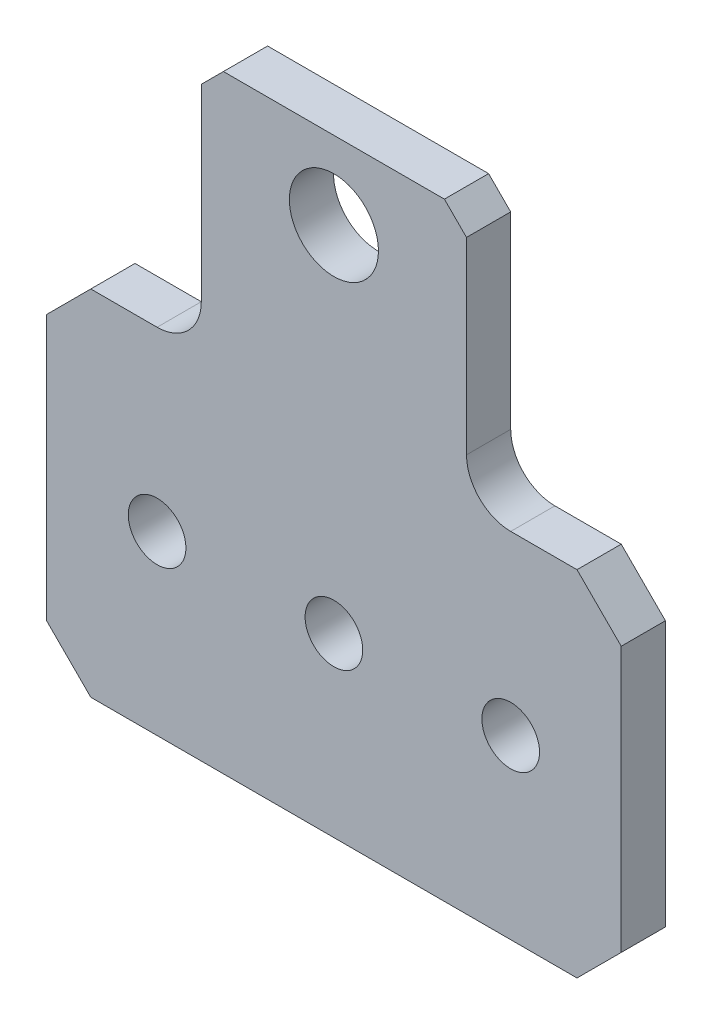
ISO-10303-21;
HEADER;
FILE_DESCRIPTION(('STEP AP214'),'2;1');
FILE_NAME('part.step','',(''),(''),'','','');
FILE_SCHEMA(('AUTOMOTIVE_DESIGN { 1 0 10303 214 1 1 1 1 }'));
ENDSEC;
DATA;
#1=APPLICATION_CONTEXT('core data for automotive mechanical design processes');
#2=APPLICATION_PROTOCOL_DEFINITION('international standard','automotive_design',2000,#1);
#3=PRODUCT_CONTEXT('',#1,'mechanical');
#4=PRODUCT('Part','Part','',(#3));
#5=PRODUCT_RELATED_PRODUCT_CATEGORY('part','',(#4));
#6=PRODUCT_DEFINITION_FORMATION('','',#4);
#7=PRODUCT_DEFINITION_CONTEXT('part definition',#1,'design');
#8=PRODUCT_DEFINITION('design','',#6,#7);
#9=PRODUCT_DEFINITION_SHAPE('','',#8);
#10=(LENGTH_UNIT() NAMED_UNIT(*) SI_UNIT(.MILLI.,.METRE.));
#11=(NAMED_UNIT(*) PLANE_ANGLE_UNIT() SI_UNIT($,.RADIAN.));
#12=(NAMED_UNIT(*) SI_UNIT($,.STERADIAN.) SOLID_ANGLE_UNIT());
#13=UNCERTAINTY_MEASURE_WITH_UNIT(LENGTH_MEASURE(1.E-05),#10,'distance_accuracy_value','');
#14=(GEOMETRIC_REPRESENTATION_CONTEXT(3) GLOBAL_UNCERTAINTY_ASSIGNED_CONTEXT((#13)) GLOBAL_UNIT_ASSIGNED_CONTEXT((#10,
#11,#12)) REPRESENTATION_CONTEXT('',''));
#15=CARTESIAN_POINT('',(0.,0.,0.));
#16=DIRECTION('',(0.,0.,1.));
#17=DIRECTION('',(1.,0.,0.));
#18=AXIS2_PLACEMENT_3D('',#15,#16,#17);
#19=CARTESIAN_POINT('',(12.7,-15.494,3.175));
#20=DIRECTION('',(0.,1.,0.));
#21=DIRECTION('',(-1.,0.,0.));
#22=AXIS2_PLACEMENT_3D('',#19,#20,#21);
#23=PLANE('',#22);
#24=DIRECTION('',(1.,0.,0.));
#25=VECTOR('',#24,1.);
#26=CARTESIAN_POINT('',(12.7,-15.494,0.));
#27=LINE('',#26,#25);
#28=CARTESIAN_POINT('',(12.7,-15.494,0.));
#29=VERTEX_POINT('',#28);
#30=CARTESIAN_POINT('',(17.4625,-15.494,0.));
#31=VERTEX_POINT('',#30);
#32=EDGE_CURVE('E177',#29,#31,#27,.T.);
#33=ORIENTED_EDGE('',*,*,#32,.F.);
#34=DIRECTION('',(0.,0.,-1.));
#35=VECTOR('',#34,1.);
#36=CARTESIAN_POINT('',(12.7,-15.494,3.175));
#37=LINE('',#36,#35);
#38=CARTESIAN_POINT('',(12.7,-15.494,3.175));
#39=VERTEX_POINT('',#38);
#40=EDGE_CURVE('E11',#39,#29,#37,.T.);
#41=ORIENTED_EDGE('',*,*,#40,.F.);
#42=DIRECTION('',(1.,0.,0.));
#43=VECTOR('',#42,1.);
#44=CARTESIAN_POINT('',(12.7,-15.494,3.175));
#45=LINE('',#44,#43);
#46=CARTESIAN_POINT('',(17.4625,-15.494,3.175));
#47=VERTEX_POINT('',#46);
#48=EDGE_CURVE('E219',#39,#47,#45,.T.);
#49=ORIENTED_EDGE('',*,*,#48,.T.);
#50=DIRECTION('',(0.,0.,-1.));
#51=VECTOR('',#50,1.);
#52=CARTESIAN_POINT('',(17.4625,-15.494,3.175));
#53=LINE('',#52,#51);
#54=EDGE_CURVE('E38',#47,#31,#53,.T.);
#55=ORIENTED_EDGE('',*,*,#54,.T.);
#56=EDGE_LOOP('',(#33,#41,#49,#55));
#57=FACE_BOUND('',#56,.T.);
#58=ADVANCED_FACE('F35',(#57),#23,.T.);
#59=CARTESIAN_POINT('',(12.7,-12.319,3.175));
#60=DIRECTION('',(0.,0.,-1.));
#61=DIRECTION('',(-1.,0.,0.));
#62=AXIS2_PLACEMENT_3D('',#59,#60,#61);
#63=CYLINDRICAL_SURFACE('',#62,3.175);
#64=CARTESIAN_POINT('',(12.7,-12.319,0.));
#65=DIRECTION('',(0.,0.,1.));
#66=DIRECTION('',(1.,0.,0.));
#67=AXIS2_PLACEMENT_3D('',#64,#65,#66);
#68=CIRCLE('',#67,3.175);
#69=CARTESIAN_POINT('',(9.525,-12.319,0.));
#70=VERTEX_POINT('',#69);
#71=EDGE_CURVE('E217',#70,#29,#68,.T.);
#72=ORIENTED_EDGE('',*,*,#71,.F.);
#73=DIRECTION('',(0.,0.,-1.));
#74=VECTOR('',#73,1.);
#75=CARTESIAN_POINT('',(9.525,-12.319,3.175));
#76=LINE('',#75,#74);
#77=CARTESIAN_POINT('',(9.525,-12.319,3.175));
#78=VERTEX_POINT('',#77);
#79=EDGE_CURVE('E44',#78,#70,#76,.T.);
#80=ORIENTED_EDGE('',*,*,#79,.F.);
#81=CARTESIAN_POINT('',(12.7,-12.319,3.175));
#82=DIRECTION('',(0.,0.,1.));
#83=DIRECTION('',(1.,0.,0.));
#84=AXIS2_PLACEMENT_3D('',#81,#82,#83);
#85=CIRCLE('',#84,3.175);
#86=EDGE_CURVE('E165',#78,#39,#85,.T.);
#87=ORIENTED_EDGE('',*,*,#86,.T.);
#88=ORIENTED_EDGE('',*,*,#40,.T.);
#89=EDGE_LOOP('',(#72,#80,#87,#88));
#90=FACE_BOUND('',#89,.T.);
#91=ADVANCED_FACE('F248',(#90),#63,.F.);
#92=CARTESIAN_POINT('',(9.525,1.2065,3.175));
#93=DIRECTION('',(1.,0.,0.));
#94=DIRECTION('',(0.,0.,-1.));
#95=AXIS2_PLACEMENT_3D('',#92,#93,#94);
#96=PLANE('',#95);
#97=DIRECTION('',(0.,-1.,0.));
#98=VECTOR('',#97,1.);
#99=CARTESIAN_POINT('',(9.525,1.2065,0.));
#100=LINE('',#99,#98);
#101=CARTESIAN_POINT('',(9.525,1.2065,0.));
#102=VERTEX_POINT('',#101);
#103=EDGE_CURVE('E151',#102,#70,#100,.T.);
#104=ORIENTED_EDGE('',*,*,#103,.F.);
#105=DIRECTION('',(0.,0.,-1.));
#106=VECTOR('',#105,1.);
#107=CARTESIAN_POINT('',(9.525,1.2065,3.175));
#108=LINE('',#107,#106);
#109=CARTESIAN_POINT('',(9.525,1.2065,3.175));
#110=VERTEX_POINT('',#109);
#111=EDGE_CURVE('E146',#110,#102,#108,.T.);
#112=ORIENTED_EDGE('',*,*,#111,.F.);
#113=DIRECTION('',(0.,-1.,0.));
#114=VECTOR('',#113,1.);
#115=CARTESIAN_POINT('',(9.525,1.2065,3.175));
#116=LINE('',#115,#114);
#117=EDGE_CURVE('E149',#110,#78,#116,.T.);
#118=ORIENTED_EDGE('',*,*,#117,.T.);
#119=ORIENTED_EDGE('',*,*,#79,.T.);
#120=EDGE_LOOP('',(#104,#112,#118,#119));
#121=FACE_BOUND('',#120,.T.);
#122=ADVANCED_FACE('F148',(#121),#96,.T.);
#123=CARTESIAN_POINT('',(7.93749999999999,2.794,3.175));
#124=DIRECTION('',(0.707106781186546,0.707106781186549,0.));
#125=DIRECTION('',(-0.707106781186549,0.707106781186546,0.));
#126=AXIS2_PLACEMENT_3D('',#123,#124,#125);
#127=PLANE('',#126);
#128=DIRECTION('',(0.707106781186549,-0.707106781186546,0.));
#129=VECTOR('',#128,1.);
#130=CARTESIAN_POINT('',(7.93749999999999,2.794,0.));
#131=LINE('',#130,#129);
#132=CARTESIAN_POINT('',(7.93749999999999,2.794,0.));
#133=VERTEX_POINT('',#132);
#134=EDGE_CURVE('E214',#133,#102,#131,.T.);
#135=ORIENTED_EDGE('',*,*,#134,.F.);
#136=DIRECTION('',(0.,0.,-1.));
#137=VECTOR('',#136,1.);
#138=CARTESIAN_POINT('',(7.93749999999999,2.794,3.175));
#139=LINE('',#138,#137);
#140=CARTESIAN_POINT('',(7.93749999999999,2.794,3.175));
#141=VERTEX_POINT('',#140);
#142=EDGE_CURVE('E156',#141,#133,#139,.T.);
#143=ORIENTED_EDGE('',*,*,#142,.F.);
#144=DIRECTION('',(0.707106781186549,-0.707106781186546,0.));
#145=VECTOR('',#144,1.);
#146=CARTESIAN_POINT('',(7.93749999999999,2.794,3.175));
#147=LINE('',#146,#145);
#148=EDGE_CURVE('E164',#141,#110,#147,.T.);
#149=ORIENTED_EDGE('',*,*,#148,.T.);
#150=ORIENTED_EDGE('',*,*,#111,.T.);
#151=EDGE_LOOP('',(#135,#143,#149,#150));
#152=FACE_BOUND('',#151,.T.);
#153=ADVANCED_FACE('F168',(#152),#127,.T.);
#154=CARTESIAN_POINT('',(-9.525,1.20650000000001,3.175));
#155=DIRECTION('',(-0.707106781186547,0.707106781186548,0.));
#156=DIRECTION('',(-0.707106781186548,-0.707106781186547,0.));
#157=AXIS2_PLACEMENT_3D('',#154,#155,#156);
#158=PLANE('',#157);
#159=DIRECTION('',(0.707106781186548,0.707106781186547,0.));
#160=VECTOR('',#159,1.);
#161=CARTESIAN_POINT('',(-9.525,1.20650000000001,0.));
#162=LINE('',#161,#160);
#163=CARTESIAN_POINT('',(-9.525,1.20650000000001,0.));
#164=VERTEX_POINT('',#163);
#165=CARTESIAN_POINT('',(-7.93749999999999,2.794,0.));
#166=VERTEX_POINT('',#165);
#167=EDGE_CURVE('E211',#164,#166,#162,.T.);
#168=ORIENTED_EDGE('',*,*,#167,.F.);
#169=DIRECTION('',(0.,0.,-1.));
#170=VECTOR('',#169,1.);
#171=CARTESIAN_POINT('',(-9.525,1.20650000000001,3.175));
#172=LINE('',#171,#170);
#173=CARTESIAN_POINT('',(-9.525,1.20650000000001,3.175));
#174=VERTEX_POINT('',#173);
#175=EDGE_CURVE('E226',#174,#164,#172,.T.);
#176=ORIENTED_EDGE('',*,*,#175,.F.);
#177=DIRECTION('',(0.707106781186548,0.707106781186547,0.));
#178=VECTOR('',#177,1.);
#179=CARTESIAN_POINT('',(-9.525,1.20650000000001,3.175));
#180=LINE('',#179,#178);
#181=CARTESIAN_POINT('',(-7.93749999999999,2.794,3.175));
#182=VERTEX_POINT('',#181);
#183=EDGE_CURVE('E169',#174,#182,#180,.T.);
#184=ORIENTED_EDGE('',*,*,#183,.T.);
#185=DIRECTION('',(0.,0.,-1.));
#186=VECTOR('',#185,1.);
#187=CARTESIAN_POINT('',(-7.93749999999999,2.794,3.175));
#188=LINE('',#187,#186);
#189=EDGE_CURVE('E223',#182,#166,#188,.T.);
#190=ORIENTED_EDGE('',*,*,#189,.T.);
#191=EDGE_LOOP('',(#168,#176,#184,#190));
#192=FACE_BOUND('',#191,.T.);
#193=ADVANCED_FACE('F261',(#192),#158,.T.);
#194=CARTESIAN_POINT('',(-9.52499999999999,-12.319,3.175));
#195=DIRECTION('',(-1.,0.,0.));
#196=DIRECTION('',(0.,-1.,0.));
#197=AXIS2_PLACEMENT_3D('',#194,#195,#196);
#198=PLANE('',#197);
#199=DIRECTION('',(0.,1.,0.));
#200=VECTOR('',#199,1.);
#201=CARTESIAN_POINT('',(-9.52499999999999,-12.319,0.));
#202=LINE('',#201,#200);
#203=CARTESIAN_POINT('',(-9.52499999999999,-12.319,0.));
#204=VERTEX_POINT('',#203);
#205=EDGE_CURVE('E208',#204,#164,#202,.T.);
#206=ORIENTED_EDGE('',*,*,#205,.F.);
#207=DIRECTION('',(0.,0.,-1.));
#208=VECTOR('',#207,1.);
#209=CARTESIAN_POINT('',(-9.52499999999999,-12.319,3.175));
#210=LINE('',#209,#208);
#211=CARTESIAN_POINT('',(-9.52499999999999,-12.319,3.175));
#212=VERTEX_POINT('',#211);
#213=EDGE_CURVE('E228',#212,#204,#210,.T.);
#214=ORIENTED_EDGE('',*,*,#213,.F.);
#215=DIRECTION('',(0.,1.,0.));
#216=VECTOR('',#215,1.);
#217=CARTESIAN_POINT('',(-9.52499999999999,-12.319,3.175));
#218=LINE('',#217,#216);
#219=EDGE_CURVE('E172',#212,#174,#218,.T.);
#220=ORIENTED_EDGE('',*,*,#219,.T.);
#221=ORIENTED_EDGE('',*,*,#175,.T.);
#222=EDGE_LOOP('',(#206,#214,#220,#221));
#223=FACE_BOUND('',#222,.T.);
#224=ADVANCED_FACE('F264',(#223),#198,.T.);
#225=CARTESIAN_POINT('',(-12.7,-12.319,3.175));
#226=DIRECTION('',(0.,0.,-1.));
#227=DIRECTION('',(-1.,0.,0.));
#228=AXIS2_PLACEMENT_3D('',#225,#226,#227);
#229=CYLINDRICAL_SURFACE('',#228,3.175);
#230=CARTESIAN_POINT('',(-12.7,-12.319,0.));
#231=DIRECTION('',(0.,0.,1.));
#232=DIRECTION('',(1.,0.,0.));
#233=AXIS2_PLACEMENT_3D('',#230,#231,#232);
#234=CIRCLE('',#233,3.175);
#235=CARTESIAN_POINT('',(-12.7,-15.494,0.));
#236=VERTEX_POINT('',#235);
#237=EDGE_CURVE('E205',#236,#204,#234,.T.);
#238=ORIENTED_EDGE('',*,*,#237,.F.);
#239=DIRECTION('',(0.,0.,-1.));
#240=VECTOR('',#239,1.);
#241=CARTESIAN_POINT('',(-12.7,-15.494,3.175));
#242=LINE('',#241,#240);
#243=CARTESIAN_POINT('',(-12.7,-15.494,3.175));
#244=VERTEX_POINT('',#243);
#245=EDGE_CURVE('E230',#244,#236,#242,.T.);
#246=ORIENTED_EDGE('',*,*,#245,.F.);
#247=CARTESIAN_POINT('',(-12.7,-12.319,3.175));
#248=DIRECTION('',(0.,0.,1.));
#249=DIRECTION('',(1.,0.,0.));
#250=AXIS2_PLACEMENT_3D('',#247,#248,#249);
#251=CIRCLE('',#250,3.175);
#252=EDGE_CURVE('E387',#244,#212,#251,.T.);
#253=ORIENTED_EDGE('',*,*,#252,.T.);
#254=ORIENTED_EDGE('',*,*,#213,.T.);
#255=EDGE_LOOP('',(#238,#246,#253,#254));
#256=FACE_BOUND('',#255,.T.);
#257=ADVANCED_FACE('F268',(#256),#229,.F.);
#258=CARTESIAN_POINT('',(-17.4625,-15.494,3.175));
#259=DIRECTION('',(0.,1.,0.));
#260=DIRECTION('',(0.,0.,1.));
#261=AXIS2_PLACEMENT_3D('',#258,#259,#260);
#262=PLANE('',#261);
#263=DIRECTION('',(1.,0.,0.));
#264=VECTOR('',#263,1.);
#265=CARTESIAN_POINT('',(-17.4625,-15.494,0.));
#266=LINE('',#265,#264);
#267=CARTESIAN_POINT('',(-17.4625,-15.494,0.));
#268=VERTEX_POINT('',#267);
#269=EDGE_CURVE('E202',#268,#236,#266,.T.);
#270=ORIENTED_EDGE('',*,*,#269,.F.);
#271=DIRECTION('',(0.,0.,-1.));
#272=VECTOR('',#271,1.);
#273=CARTESIAN_POINT('',(-17.4625,-15.494,3.175));
#274=LINE('',#273,#272);
#275=CARTESIAN_POINT('',(-17.4625,-15.494,3.175));
#276=VERTEX_POINT('',#275);
#277=EDGE_CURVE('E232',#276,#268,#274,.T.);
#278=ORIENTED_EDGE('',*,*,#277,.F.);
#279=DIRECTION('',(1.,0.,0.));
#280=VECTOR('',#279,1.);
#281=CARTESIAN_POINT('',(-17.4625,-15.494,3.175));
#282=LINE('',#281,#280);
#283=EDGE_CURVE('E384',#276,#244,#282,.T.);
#284=ORIENTED_EDGE('',*,*,#283,.T.);
#285=ORIENTED_EDGE('',*,*,#245,.T.);
#286=EDGE_LOOP('',(#270,#278,#284,#285));
#287=FACE_BOUND('',#286,.T.);
#288=ADVANCED_FACE('F272',(#287),#262,.T.);
#289=CARTESIAN_POINT('',(-20.6375,-18.669,3.175));
#290=DIRECTION('',(-0.707106781186549,0.707106781186546,0.));
#291=DIRECTION('',(-0.707106781186546,-0.707106781186549,0.));
#292=AXIS2_PLACEMENT_3D('',#289,#290,#291);
#293=PLANE('',#292);
#294=DIRECTION('',(0.707106781186546,0.707106781186549,0.));
#295=VECTOR('',#294,1.);
#296=CARTESIAN_POINT('',(-20.6375,-18.669,0.));
#297=LINE('',#296,#295);
#298=CARTESIAN_POINT('',(-20.6375,-18.669,0.));
#299=VERTEX_POINT('',#298);
#300=EDGE_CURVE('E199',#299,#268,#297,.T.);
#301=ORIENTED_EDGE('',*,*,#300,.F.);
#302=DIRECTION('',(0.,0.,-1.));
#303=VECTOR('',#302,1.);
#304=CARTESIAN_POINT('',(-20.6375,-18.669,3.175));
#305=LINE('',#304,#303);
#306=CARTESIAN_POINT('',(-20.6375,-18.669,3.175));
#307=VERTEX_POINT('',#306);
#308=EDGE_CURVE('E234',#307,#299,#305,.T.);
#309=ORIENTED_EDGE('',*,*,#308,.F.);
#310=DIRECTION('',(0.707106781186546,0.707106781186549,0.));
#311=VECTOR('',#310,1.);
#312=CARTESIAN_POINT('',(-20.6375,-18.669,3.175));
#313=LINE('',#312,#311);
#314=EDGE_CURVE('E381',#307,#276,#313,.T.);
#315=ORIENTED_EDGE('',*,*,#314,.T.);
#316=ORIENTED_EDGE('',*,*,#277,.T.);
#317=EDGE_LOOP('',(#301,#309,#315,#316));
#318=FACE_BOUND('',#317,.T.);
#319=ADVANCED_FACE('F276',(#318),#293,.T.);
#320=CARTESIAN_POINT('',(-20.6375,-37.719,3.175));
#321=DIRECTION('',(-1.,0.,0.));
#322=DIRECTION('',(0.,-1.,0.));
#323=AXIS2_PLACEMENT_3D('',#320,#321,#322);
#324=PLANE('',#323);
#325=DIRECTION('',(0.,1.,0.));
#326=VECTOR('',#325,1.);
#327=CARTESIAN_POINT('',(-20.6375,-37.719,0.));
#328=LINE('',#327,#326);
#329=CARTESIAN_POINT('',(-20.6375,-37.719,0.));
#330=VERTEX_POINT('',#329);
#331=EDGE_CURVE('E196',#330,#299,#328,.T.);
#332=ORIENTED_EDGE('',*,*,#331,.F.);
#333=DIRECTION('',(0.,0.,-1.));
#334=VECTOR('',#333,1.);
#335=CARTESIAN_POINT('',(-20.6375,-37.719,3.175));
#336=LINE('',#335,#334);
#337=CARTESIAN_POINT('',(-20.6375,-37.719,3.175));
#338=VERTEX_POINT('',#337);
#339=EDGE_CURVE('E236',#338,#330,#336,.T.);
#340=ORIENTED_EDGE('',*,*,#339,.F.);
#341=DIRECTION('',(0.,1.,0.));
#342=VECTOR('',#341,1.);
#343=CARTESIAN_POINT('',(-20.6375,-37.719,3.175));
#344=LINE('',#343,#342);
#345=EDGE_CURVE('E378',#338,#307,#344,.T.);
#346=ORIENTED_EDGE('',*,*,#345,.T.);
#347=ORIENTED_EDGE('',*,*,#308,.T.);
#348=EDGE_LOOP('',(#332,#340,#346,#347));
#349=FACE_BOUND('',#348,.T.);
#350=ADVANCED_FACE('F280',(#349),#324,.T.);
#351=CARTESIAN_POINT('',(-17.4625,-40.894,3.175));
#352=DIRECTION('',(-0.707106781186548,-0.707106781186548,0.));
#353=DIRECTION('',(0.707106781186548,-0.707106781186548,0.));
#354=AXIS2_PLACEMENT_3D('',#351,#352,#353);
#355=PLANE('',#354);
#356=DIRECTION('',(-0.707106781186547,0.707106781186547,0.));
#357=VECTOR('',#356,1.);
#358=CARTESIAN_POINT('',(-17.4625,-40.894,0.));
#359=LINE('',#358,#357);
#360=CARTESIAN_POINT('',(-17.4625,-40.894,0.));
#361=VERTEX_POINT('',#360);
#362=EDGE_CURVE('E193',#361,#330,#359,.T.);
#363=ORIENTED_EDGE('',*,*,#362,.F.);
#364=DIRECTION('',(0.,0.,-1.));
#365=VECTOR('',#364,1.);
#366=CARTESIAN_POINT('',(-17.4625,-40.894,3.175));
#367=LINE('',#366,#365);
#368=CARTESIAN_POINT('',(-17.4625,-40.894,3.175));
#369=VERTEX_POINT('',#368);
#370=EDGE_CURVE('E238',#369,#361,#367,.T.);
#371=ORIENTED_EDGE('',*,*,#370,.F.);
#372=DIRECTION('',(-0.707106781186547,0.707106781186547,0.));
#373=VECTOR('',#372,1.);
#374=CARTESIAN_POINT('',(-17.4625,-40.894,3.175));
#375=LINE('',#374,#373);
#376=EDGE_CURVE('E375',#369,#338,#375,.T.);
#377=ORIENTED_EDGE('',*,*,#376,.T.);
#378=ORIENTED_EDGE('',*,*,#339,.T.);
#379=EDGE_LOOP('',(#363,#371,#377,#378));
#380=FACE_BOUND('',#379,.T.);
#381=ADVANCED_FACE('F284',(#380),#355,.T.);
#382=CARTESIAN_POINT('',(17.4625,-40.894,3.175));
#383=DIRECTION('',(0.,-1.,0.));
#384=DIRECTION('',(1.,0.,0.));
#385=AXIS2_PLACEMENT_3D('',#382,#383,#384);
#386=PLANE('',#385);
#387=DIRECTION('',(-1.,0.,0.));
#388=VECTOR('',#387,1.);
#389=CARTESIAN_POINT('',(17.4625,-40.894,0.));
#390=LINE('',#389,#388);
#391=CARTESIAN_POINT('',(17.4625,-40.894,0.));
#392=VERTEX_POINT('',#391);
#393=EDGE_CURVE('E190',#392,#361,#390,.T.);
#394=ORIENTED_EDGE('',*,*,#393,.F.);
#395=DIRECTION('',(0.,0.,-1.));
#396=VECTOR('',#395,1.);
#397=CARTESIAN_POINT('',(17.4625,-40.894,3.175));
#398=LINE('',#397,#396);
#399=CARTESIAN_POINT('',(17.4625,-40.894,3.175));
#400=VERTEX_POINT('',#399);
#401=EDGE_CURVE('E240',#400,#392,#398,.T.);
#402=ORIENTED_EDGE('',*,*,#401,.F.);
#403=DIRECTION('',(-1.,0.,0.));
#404=VECTOR('',#403,1.);
#405=CARTESIAN_POINT('',(17.4625,-40.894,3.175));
#406=LINE('',#405,#404);
#407=EDGE_CURVE('E372',#400,#369,#406,.T.);
#408=ORIENTED_EDGE('',*,*,#407,.T.);
#409=ORIENTED_EDGE('',*,*,#370,.T.);
#410=EDGE_LOOP('',(#394,#402,#408,#409));
#411=FACE_BOUND('',#410,.T.);
#412=ADVANCED_FACE('F288',(#411),#386,.T.);
#413=CARTESIAN_POINT('',(20.6375,-37.719,3.175));
#414=DIRECTION('',(0.707106781186549,-0.707106781186546,0.));
#415=DIRECTION('',(0.707106781186546,0.707106781186549,0.));
#416=AXIS2_PLACEMENT_3D('',#413,#414,#415);
#417=PLANE('',#416);
#418=DIRECTION('',(-0.707106781186546,-0.707106781186549,0.));
#419=VECTOR('',#418,1.);
#420=CARTESIAN_POINT('',(20.6375,-37.719,0.));
#421=LINE('',#420,#419);
#422=CARTESIAN_POINT('',(20.6375,-37.719,0.));
#423=VERTEX_POINT('',#422);
#424=EDGE_CURVE('E187',#423,#392,#421,.T.);
#425=ORIENTED_EDGE('',*,*,#424,.F.);
#426=DIRECTION('',(0.,0.,-1.));
#427=VECTOR('',#426,1.);
#428=CARTESIAN_POINT('',(20.6375,-37.719,3.175));
#429=LINE('',#428,#427);
#430=CARTESIAN_POINT('',(20.6375,-37.719,3.175));
#431=VERTEX_POINT('',#430);
#432=EDGE_CURVE('E242',#431,#423,#429,.T.);
#433=ORIENTED_EDGE('',*,*,#432,.F.);
#434=DIRECTION('',(-0.707106781186546,-0.707106781186549,0.));
#435=VECTOR('',#434,1.);
#436=CARTESIAN_POINT('',(20.6375,-37.719,3.175));
#437=LINE('',#436,#435);
#438=EDGE_CURVE('E369',#431,#400,#437,.T.);
#439=ORIENTED_EDGE('',*,*,#438,.T.);
#440=ORIENTED_EDGE('',*,*,#401,.T.);
#441=EDGE_LOOP('',(#425,#433,#439,#440));
#442=FACE_BOUND('',#441,.T.);
#443=ADVANCED_FACE('F292',(#442),#417,.T.);
#444=CARTESIAN_POINT('',(20.6375,-18.669,3.175));
#445=DIRECTION('',(1.,0.,0.));
#446=DIRECTION('',(0.,0.,-1.));
#447=AXIS2_PLACEMENT_3D('',#444,#445,#446);
#448=PLANE('',#447);
#449=DIRECTION('',(0.,-1.,0.));
#450=VECTOR('',#449,1.);
#451=CARTESIAN_POINT('',(20.6375,-18.669,0.));
#452=LINE('',#451,#450);
#453=CARTESIAN_POINT('',(20.6375,-18.669,0.));
#454=VERTEX_POINT('',#453);
#455=EDGE_CURVE('E184',#454,#423,#452,.T.);
#456=ORIENTED_EDGE('',*,*,#455,.F.);
#457=DIRECTION('',(0.,0.,-1.));
#458=VECTOR('',#457,1.);
#459=CARTESIAN_POINT('',(20.6375,-18.669,3.175));
#460=LINE('',#459,#458);
#461=CARTESIAN_POINT('',(20.6375,-18.669,3.175));
#462=VERTEX_POINT('',#461);
#463=EDGE_CURVE('E243',#462,#454,#460,.T.);
#464=ORIENTED_EDGE('',*,*,#463,.F.);
#465=DIRECTION('',(0.,-1.,0.));
#466=VECTOR('',#465,1.);
#467=CARTESIAN_POINT('',(20.6375,-18.669,3.175));
#468=LINE('',#467,#466);
#469=EDGE_CURVE('E366',#462,#431,#468,.T.);
#470=ORIENTED_EDGE('',*,*,#469,.T.);
#471=ORIENTED_EDGE('',*,*,#432,.T.);
#472=EDGE_LOOP('',(#456,#464,#470,#471));
#473=FACE_BOUND('',#472,.T.);
#474=ADVANCED_FACE('F296',(#473),#448,.T.);
#475=CARTESIAN_POINT('',(17.4625,-15.494,3.175));
#476=DIRECTION('',(0.707106781186548,0.707106781186547,0.));
#477=DIRECTION('',(-0.707106781186547,0.707106781186548,0.));
#478=AXIS2_PLACEMENT_3D('',#475,#476,#477);
#479=PLANE('',#478);
#480=DIRECTION('',(0.707106781186547,-0.707106781186548,0.));
#481=VECTOR('',#480,1.);
#482=CARTESIAN_POINT('',(17.4625,-15.494,0.));
#483=LINE('',#482,#481);
#484=EDGE_CURVE('E180',#31,#454,#483,.T.);
#485=ORIENTED_EDGE('',*,*,#484,.F.);
#486=ORIENTED_EDGE('',*,*,#54,.F.);
#487=DIRECTION('',(0.707106781186547,-0.707106781186548,0.));
#488=VECTOR('',#487,1.);
#489=CARTESIAN_POINT('',(17.4625,-15.494,3.175));
#490=LINE('',#489,#488);
#491=EDGE_CURVE('E364',#47,#462,#490,.T.);
#492=ORIENTED_EDGE('',*,*,#491,.T.);
#493=ORIENTED_EDGE('',*,*,#463,.T.);
#494=EDGE_LOOP('',(#485,#486,#492,#493));
#495=FACE_BOUND('',#494,.T.);
#496=ADVANCED_FACE('F245',(#495),#479,.T.);
#497=CARTESIAN_POINT('',(-12.7,-12.319,3.175));
#498=DIRECTION('',(0.,0.,1.));
#499=DIRECTION('',(1.,0.,0.));
#500=AXIS2_PLACEMENT_3D('',#497,#498,#499);
#501=PLANE('',#500);
#502=DIRECTION('',(1.,0.,0.));
#503=VECTOR('',#502,1.);
#504=CARTESIAN_POINT('',(-10.8453946032183,2.794,3.175));
#505=LINE('',#504,#503);
#506=EDGE_CURVE('E335',#182,#141,#505,.T.);
#507=ORIENTED_EDGE('',*,*,#506,.F.);
#508=ORIENTED_EDGE('',*,*,#183,.F.);
#509=ORIENTED_EDGE('',*,*,#219,.F.);
#510=ORIENTED_EDGE('',*,*,#252,.F.);
#511=ORIENTED_EDGE('',*,*,#283,.F.);
#512=ORIENTED_EDGE('',*,*,#314,.F.);
#513=ORIENTED_EDGE('',*,*,#345,.F.);
#514=ORIENTED_EDGE('',*,*,#376,.F.);
#515=ORIENTED_EDGE('',*,*,#407,.F.);
#516=ORIENTED_EDGE('',*,*,#438,.F.);
#517=ORIENTED_EDGE('',*,*,#469,.F.);
#518=ORIENTED_EDGE('',*,*,#491,.F.);
#519=ORIENTED_EDGE('',*,*,#48,.F.);
#520=ORIENTED_EDGE('',*,*,#86,.F.);
#521=ORIENTED_EDGE('',*,*,#117,.F.);
#522=ORIENTED_EDGE('',*,*,#148,.F.);
#523=EDGE_LOOP('',(#507,#508,#509,#510,#511,#512,#513,#514,#515,#516,#517,#518,#519,#520,#521,#522));
#524=FACE_BOUND('',#523,.T.);
#525=CARTESIAN_POINT('',(0.,-28.194,3.175));
#526=DIRECTION('',(0.,0.,-1.));
#527=DIRECTION('',(1.,0.,0.));
#528=AXIS2_PLACEMENT_3D('',#525,#526,#527);
#529=CIRCLE('',#528,2.0701);
#530=CARTESIAN_POINT('',(2.07010000000001,-28.194,3.175));
#531=VERTEX_POINT('',#530);
#532=EDGE_CURVE('E340',#531,#531,#529,.T.);
#533=ORIENTED_EDGE('',*,*,#532,.T.);
#534=EDGE_LOOP('',(#533));
#535=FACE_BOUND('',#534,.T.);
#536=CARTESIAN_POINT('',(12.7,-28.194,3.175));
#537=DIRECTION('',(0.,0.,-1.));
#538=DIRECTION('',(1.,0.,0.));
#539=AXIS2_PLACEMENT_3D('',#536,#537,#538);
#540=CIRCLE('',#539,2.0701);
#541=CARTESIAN_POINT('',(14.7701,-28.194,3.175));
#542=VERTEX_POINT('',#541);
#543=EDGE_CURVE('E347',#542,#542,#540,.T.);
#544=ORIENTED_EDGE('',*,*,#543,.T.);
#545=EDGE_LOOP('',(#544));
#546=FACE_BOUND('',#545,.T.);
#547=CARTESIAN_POINT('',(-12.7,-28.194,3.175));
#548=DIRECTION('',(0.,0.,-1.));
#549=DIRECTION('',(1.,0.,0.));
#550=AXIS2_PLACEMENT_3D('',#547,#548,#549);
#551=CIRCLE('',#550,2.0701);
#552=CARTESIAN_POINT('',(-10.6299,-28.194,3.175));
#553=VERTEX_POINT('',#552);
#554=EDGE_CURVE('E353',#553,#553,#551,.T.);
#555=ORIENTED_EDGE('',*,*,#554,.T.);
#556=EDGE_LOOP('',(#555));
#557=FACE_BOUND('',#556,.T.);
#558=CARTESIAN_POINT('',(0.,-2.79399999999999,3.175));
#559=DIRECTION('',(0.,0.,-1.));
#560=DIRECTION('',(1.,0.,0.));
#561=AXIS2_PLACEMENT_3D('',#558,#559,#560);
#562=CIRCLE('',#561,3.2004);
#563=CARTESIAN_POINT('',(3.20040000000001,-2.79399999999999,3.175));
#564=VERTEX_POINT('',#563);
#565=EDGE_CURVE('E181',#564,#564,#562,.T.);
#566=ORIENTED_EDGE('',*,*,#565,.T.);
#567=EDGE_LOOP('',(#566));
#568=FACE_BOUND('',#567,.T.);
#569=ADVANCED_FACE('F161',(#524,#535,#546,#557,#568),#501,.T.);
#570=CARTESIAN_POINT('',(-12.7,-12.319,0.));
#571=DIRECTION('',(0.,0.,1.));
#572=DIRECTION('',(1.,0.,0.));
#573=AXIS2_PLACEMENT_3D('',#570,#571,#572);
#574=PLANE('',#573);
#575=CARTESIAN_POINT('',(0.,-28.194,0.));
#576=DIRECTION('',(0.,0.,-1.));
#577=DIRECTION('',(1.,0.,0.));
#578=AXIS2_PLACEMENT_3D('',#575,#576,#577);
#579=CIRCLE('',#578,2.0701);
#580=CARTESIAN_POINT('',(2.07010000000001,-28.194,0.));
#581=VERTEX_POINT('',#580);
#582=EDGE_CURVE('E337',#581,#581,#579,.T.);
#583=ORIENTED_EDGE('',*,*,#582,.F.);
#584=EDGE_LOOP('',(#583));
#585=FACE_BOUND('',#584,.T.);
#586=CARTESIAN_POINT('',(12.7,-28.194,0.));
#587=DIRECTION('',(0.,0.,-1.));
#588=DIRECTION('',(1.,0.,0.));
#589=AXIS2_PLACEMENT_3D('',#586,#587,#588);
#590=CIRCLE('',#589,2.0701);
#591=CARTESIAN_POINT('',(14.7701,-28.194,0.));
#592=VERTEX_POINT('',#591);
#593=EDGE_CURVE('E345',#592,#592,#590,.T.);
#594=ORIENTED_EDGE('',*,*,#593,.F.);
#595=EDGE_LOOP('',(#594));
#596=FACE_BOUND('',#595,.T.);
#597=CARTESIAN_POINT('',(-12.7,-28.194,0.));
#598=DIRECTION('',(0.,0.,-1.));
#599=DIRECTION('',(1.,0.,0.));
#600=AXIS2_PLACEMENT_3D('',#597,#598,#599);
#601=CIRCLE('',#600,2.0701);
#602=CARTESIAN_POINT('',(-10.6299,-28.194,0.));
#603=VERTEX_POINT('',#602);
#604=EDGE_CURVE('E350',#603,#603,#601,.T.);
#605=ORIENTED_EDGE('',*,*,#604,.F.);
#606=EDGE_LOOP('',(#605));
#607=FACE_BOUND('',#606,.T.);
#608=CARTESIAN_POINT('',(0.,-2.79399999999999,0.));
#609=DIRECTION('',(0.,0.,-1.));
#610=DIRECTION('',(1.,0.,0.));
#611=AXIS2_PLACEMENT_3D('',#608,#609,#610);
#612=CIRCLE('',#611,3.2004);
#613=CARTESIAN_POINT('',(3.20040000000001,-2.79399999999999,0.));
#614=VERTEX_POINT('',#613);
#615=EDGE_CURVE('E356',#614,#614,#612,.T.);
#616=ORIENTED_EDGE('',*,*,#615,.F.);
#617=EDGE_LOOP('',(#616));
#618=FACE_BOUND('',#617,.T.);
#619=ORIENTED_EDGE('',*,*,#167,.T.);
#620=DIRECTION('',(1.,0.,0.));
#621=VECTOR('',#620,1.);
#622=CARTESIAN_POINT('',(-10.8453946032183,2.794,0.));
#623=LINE('',#622,#621);
#624=EDGE_CURVE('E334',#166,#133,#623,.T.);
#625=ORIENTED_EDGE('',*,*,#624,.T.);
#626=ORIENTED_EDGE('',*,*,#134,.T.);
#627=ORIENTED_EDGE('',*,*,#103,.T.);
#628=ORIENTED_EDGE('',*,*,#71,.T.);
#629=ORIENTED_EDGE('',*,*,#32,.T.);
#630=ORIENTED_EDGE('',*,*,#484,.T.);
#631=ORIENTED_EDGE('',*,*,#455,.T.);
#632=ORIENTED_EDGE('',*,*,#424,.T.);
#633=ORIENTED_EDGE('',*,*,#393,.T.);
#634=ORIENTED_EDGE('',*,*,#362,.T.);
#635=ORIENTED_EDGE('',*,*,#331,.T.);
#636=ORIENTED_EDGE('',*,*,#300,.T.);
#637=ORIENTED_EDGE('',*,*,#269,.T.);
#638=ORIENTED_EDGE('',*,*,#237,.T.);
#639=ORIENTED_EDGE('',*,*,#205,.T.);
#640=EDGE_LOOP('',(#619,#625,#626,#627,#628,#629,#630,#631,#632,#633,#634,#635,#636,#637,#638,#639));
#641=FACE_BOUND('',#640,.T.);
#642=ADVANCED_FACE('F247',(#585,#596,#607,#618,#641),#574,.F.);
#643=CARTESIAN_POINT('',(0.,-2.79399999999999,3.175));
#644=DIRECTION('',(0.,0.,-1.));
#645=DIRECTION('',(-1.,0.,0.));
#646=AXIS2_PLACEMENT_3D('',#643,#644,#645);
#647=CYLINDRICAL_SURFACE('',#646,3.2004);
#648=ORIENTED_EDGE('',*,*,#565,.F.);
#649=EDGE_LOOP('',(#648));
#650=FACE_BOUND('',#649,.T.);
#651=ORIENTED_EDGE('',*,*,#615,.T.);
#652=EDGE_LOOP('',(#651));
#653=FACE_BOUND('',#652,.T.);
#654=ADVANCED_FACE('F307',(#650,#653),#647,.F.);
#655=CARTESIAN_POINT('',(-12.7,-28.194,3.175));
#656=DIRECTION('',(0.,0.,-1.));
#657=DIRECTION('',(-1.,0.,0.));
#658=AXIS2_PLACEMENT_3D('',#655,#656,#657);
#659=CYLINDRICAL_SURFACE('',#658,2.0701);
#660=ORIENTED_EDGE('',*,*,#554,.F.);
#661=EDGE_LOOP('',(#660));
#662=FACE_BOUND('',#661,.T.);
#663=ORIENTED_EDGE('',*,*,#604,.T.);
#664=EDGE_LOOP('',(#663));
#665=FACE_BOUND('',#664,.T.);
#666=ADVANCED_FACE('F312',(#662,#665),#659,.F.);
#667=CARTESIAN_POINT('',(12.7,-28.194,3.175));
#668=DIRECTION('',(0.,0.,-1.));
#669=DIRECTION('',(-1.,0.,0.));
#670=AXIS2_PLACEMENT_3D('',#667,#668,#669);
#671=CYLINDRICAL_SURFACE('',#670,2.0701);
#672=ORIENTED_EDGE('',*,*,#543,.F.);
#673=EDGE_LOOP('',(#672));
#674=FACE_BOUND('',#673,.T.);
#675=ORIENTED_EDGE('',*,*,#593,.T.);
#676=EDGE_LOOP('',(#675));
#677=FACE_BOUND('',#676,.T.);
#678=ADVANCED_FACE('F316',(#674,#677),#671,.F.);
#679=CARTESIAN_POINT('',(0.,-28.194,3.175));
#680=DIRECTION('',(0.,0.,-1.));
#681=DIRECTION('',(-1.,0.,0.));
#682=AXIS2_PLACEMENT_3D('',#679,#680,#681);
#683=CYLINDRICAL_SURFACE('',#682,2.0701);
#684=ORIENTED_EDGE('',*,*,#532,.F.);
#685=EDGE_LOOP('',(#684));
#686=FACE_BOUND('',#685,.T.);
#687=ORIENTED_EDGE('',*,*,#582,.T.);
#688=EDGE_LOOP('',(#687));
#689=FACE_BOUND('',#688,.T.);
#690=ADVANCED_FACE('F320',(#686,#689),#683,.F.);
#691=CARTESIAN_POINT('',(-10.8453946032183,2.794,0.));
#692=DIRECTION('',(0.,-1.,0.));
#693=DIRECTION('',(0.,0.,-1.));
#694=AXIS2_PLACEMENT_3D('',#691,#692,#693);
#695=PLANE('',#694);
#696=ORIENTED_EDGE('',*,*,#142,.T.);
#697=ORIENTED_EDGE('',*,*,#624,.F.);
#698=ORIENTED_EDGE('',*,*,#189,.F.);
#699=ORIENTED_EDGE('',*,*,#506,.T.);
#700=EDGE_LOOP('',(#696,#697,#698,#699));
#701=FACE_BOUND('',#700,.T.);
#702=ADVANCED_FACE('F324',(#701),#695,.F.);
#703=CLOSED_SHELL('',(#58,#91,#122,#153,#193,#224,#257,#288,#319,#350,#381,#412,#443,#474,#496,
#569,#642,#654,#666,#678,#690,#702));
#704=MANIFOLD_SOLID_BREP('B2',#703);
#705=ADVANCED_BREP_SHAPE_REPRESENTATION('',(#18,#704),#14);
#706=SHAPE_DEFINITION_REPRESENTATION(#9,#705);
ENDSEC;
END-ISO-10303-21;
